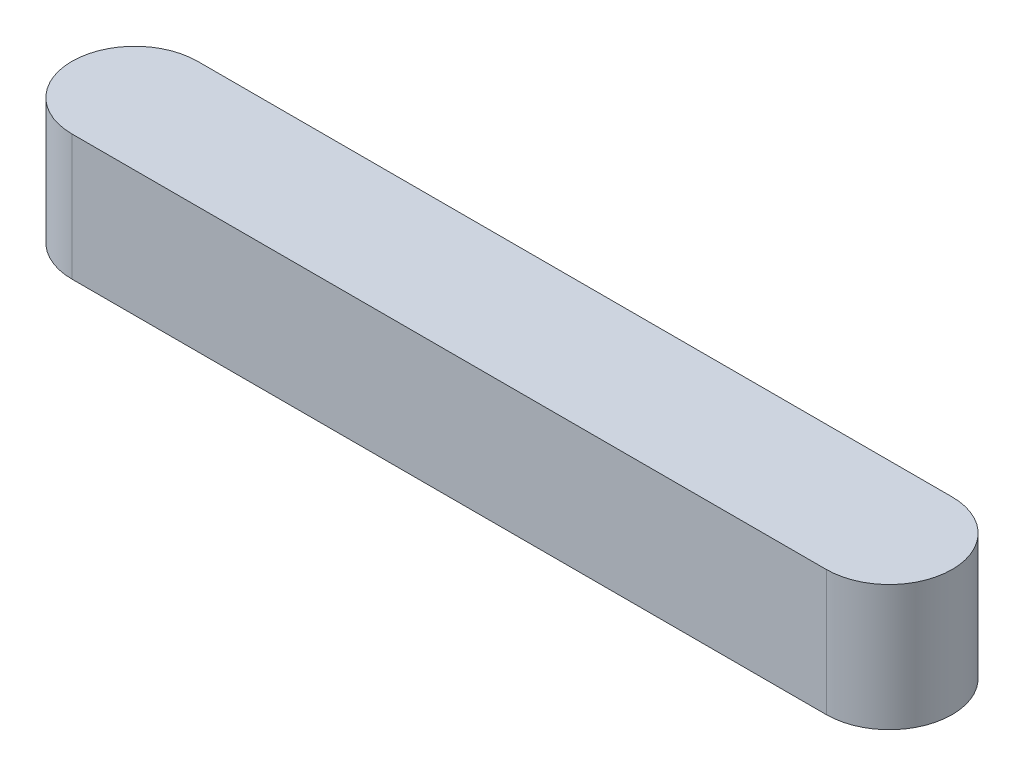
ISO-10303-21;
HEADER;
FILE_DESCRIPTION(('STEP AP214'),'2;1');
FILE_NAME('part.step','',(''),(''),'','','');
FILE_SCHEMA(('AUTOMOTIVE_DESIGN { 1 0 10303 214 1 1 1 1 }'));
ENDSEC;
DATA;
#1=APPLICATION_CONTEXT('core data for automotive mechanical design processes');
#2=APPLICATION_PROTOCOL_DEFINITION('international standard','automotive_design',2000,#1);
#3=PRODUCT_CONTEXT('',#1,'mechanical');
#4=PRODUCT('Part','Part','',(#3));
#5=PRODUCT_RELATED_PRODUCT_CATEGORY('part','',(#4));
#6=PRODUCT_DEFINITION_FORMATION('','',#4);
#7=PRODUCT_DEFINITION_CONTEXT('part definition',#1,'design');
#8=PRODUCT_DEFINITION('design','',#6,#7);
#9=PRODUCT_DEFINITION_SHAPE('','',#8);
#10=(LENGTH_UNIT() NAMED_UNIT(*) SI_UNIT(.MILLI.,.METRE.));
#11=(NAMED_UNIT(*) PLANE_ANGLE_UNIT() SI_UNIT($,.RADIAN.));
#12=(NAMED_UNIT(*) SI_UNIT($,.STERADIAN.) SOLID_ANGLE_UNIT());
#13=UNCERTAINTY_MEASURE_WITH_UNIT(LENGTH_MEASURE(1.E-05),#10,'distance_accuracy_value','');
#14=(GEOMETRIC_REPRESENTATION_CONTEXT(3) GLOBAL_UNCERTAINTY_ASSIGNED_CONTEXT((#13)) GLOBAL_UNIT_ASSIGNED_CONTEXT((#10,
#11,#12)) REPRESENTATION_CONTEXT('',''));
#15=CARTESIAN_POINT('',(0.,0.,0.));
#16=DIRECTION('',(0.,0.,1.));
#17=DIRECTION('',(1.,0.,0.));
#18=AXIS2_PLACEMENT_3D('',#15,#16,#17);
#19=CARTESIAN_POINT('',(-60.,20.,0.));
#20=DIRECTION('',(0.,-1.,0.));
#21=DIRECTION('',(0.,0.,-1.));
#22=AXIS2_PLACEMENT_3D('',#19,#20,#21);
#23=CYLINDRICAL_SURFACE('',#22,10.);
#24=CARTESIAN_POINT('',(-60.,0.,0.));
#25=DIRECTION('',(0.,1.,0.));
#26=DIRECTION('',(0.,0.,1.));
#27=AXIS2_PLACEMENT_3D('',#24,#25,#26);
#28=CIRCLE('',#27,10.);
#29=CARTESIAN_POINT('',(-60.,0.,-10.));
#30=VERTEX_POINT('',#29);
#31=CARTESIAN_POINT('',(-60.,0.,10.));
#32=VERTEX_POINT('',#31);
#33=EDGE_CURVE('E102',#30,#32,#28,.T.);
#34=ORIENTED_EDGE('',*,*,#33,.T.);
#35=DIRECTION('',(0.,-1.,0.));
#36=VECTOR('',#35,1.);
#37=CARTESIAN_POINT('',(-60.,20.,10.));
#38=LINE('',#37,#36);
#39=CARTESIAN_POINT('',(-60.,20.,10.));
#40=VERTEX_POINT('',#39);
#41=EDGE_CURVE('E11',#40,#32,#38,.T.);
#42=ORIENTED_EDGE('',*,*,#41,.F.);
#43=CARTESIAN_POINT('',(-60.,20.,0.));
#44=DIRECTION('',(0.,1.,0.));
#45=DIRECTION('',(0.,0.,1.));
#46=AXIS2_PLACEMENT_3D('',#43,#44,#45);
#47=CIRCLE('',#46,10.);
#48=CARTESIAN_POINT('',(-60.,20.,-10.));
#49=VERTEX_POINT('',#48);
#50=EDGE_CURVE('E88',#49,#40,#47,.T.);
#51=ORIENTED_EDGE('',*,*,#50,.F.);
#52=DIRECTION('',(0.,-1.,0.));
#53=VECTOR('',#52,1.);
#54=CARTESIAN_POINT('',(-60.,20.,-10.));
#55=LINE('',#54,#53);
#56=EDGE_CURVE('E55',#49,#30,#55,.T.);
#57=ORIENTED_EDGE('',*,*,#56,.T.);
#58=EDGE_LOOP('',(#34,#42,#51,#57));
#59=FACE_BOUND('',#58,.T.);
#60=ADVANCED_FACE('F39',(#59),#23,.T.);
#61=CARTESIAN_POINT('',(-60.,20.,10.));
#62=DIRECTION('',(0.,0.,-1.));
#63=DIRECTION('',(-1.,0.,0.));
#64=AXIS2_PLACEMENT_3D('',#61,#62,#63);
#65=PLANE('',#64);
#66=DIRECTION('',(1.,0.,0.));
#67=VECTOR('',#66,1.);
#68=CARTESIAN_POINT('',(-60.,0.,10.));
#69=LINE('',#68,#67);
#70=CARTESIAN_POINT('',(60.,0.,9.99999999999998));
#71=VERTEX_POINT('',#70);
#72=EDGE_CURVE('E93',#32,#71,#69,.T.);
#73=ORIENTED_EDGE('',*,*,#72,.T.);
#74=DIRECTION('',(0.,-1.,0.));
#75=VECTOR('',#74,1.);
#76=CARTESIAN_POINT('',(60.,20.,9.99999999999998));
#77=LINE('',#76,#75);
#78=CARTESIAN_POINT('',(60.,20.,9.99999999999998));
#79=VERTEX_POINT('',#78);
#80=EDGE_CURVE('E47',#79,#71,#77,.T.);
#81=ORIENTED_EDGE('',*,*,#80,.F.);
#82=DIRECTION('',(1.,0.,0.));
#83=VECTOR('',#82,1.);
#84=CARTESIAN_POINT('',(-60.,20.,10.));
#85=LINE('',#84,#83);
#86=EDGE_CURVE('E81',#40,#79,#85,.T.);
#87=ORIENTED_EDGE('',*,*,#86,.F.);
#88=ORIENTED_EDGE('',*,*,#41,.T.);
#89=EDGE_LOOP('',(#73,#81,#87,#88));
#90=FACE_BOUND('',#89,.T.);
#91=ADVANCED_FACE('F92',(#90),#65,.F.);
#92=CARTESIAN_POINT('',(60.,20.,0.));
#93=DIRECTION('',(0.,-1.,0.));
#94=DIRECTION('',(0.,0.,-1.));
#95=AXIS2_PLACEMENT_3D('',#92,#93,#94);
#96=CYLINDRICAL_SURFACE('',#95,10.);
#97=CARTESIAN_POINT('',(60.,0.,0.));
#98=DIRECTION('',(0.,1.,0.));
#99=DIRECTION('',(0.,0.,1.));
#100=AXIS2_PLACEMENT_3D('',#97,#98,#99);
#101=CIRCLE('',#100,10.);
#102=CARTESIAN_POINT('',(60.,0.,-10.));
#103=VERTEX_POINT('',#102);
#104=EDGE_CURVE('E105',#71,#103,#101,.T.);
#105=ORIENTED_EDGE('',*,*,#104,.T.);
#106=DIRECTION('',(0.,-1.,0.));
#107=VECTOR('',#106,1.);
#108=CARTESIAN_POINT('',(60.,20.,-10.));
#109=LINE('',#108,#107);
#110=CARTESIAN_POINT('',(60.,20.,-10.));
#111=VERTEX_POINT('',#110);
#112=EDGE_CURVE('E70',#111,#103,#109,.T.);
#113=ORIENTED_EDGE('',*,*,#112,.F.);
#114=CARTESIAN_POINT('',(60.,20.,0.));
#115=DIRECTION('',(0.,1.,0.));
#116=DIRECTION('',(0.,0.,1.));
#117=AXIS2_PLACEMENT_3D('',#114,#115,#116);
#118=CIRCLE('',#117,10.);
#119=EDGE_CURVE('E87',#79,#111,#118,.T.);
#120=ORIENTED_EDGE('',*,*,#119,.F.);
#121=ORIENTED_EDGE('',*,*,#80,.T.);
#122=EDGE_LOOP('',(#105,#113,#120,#121));
#123=FACE_BOUND('',#122,.T.);
#124=ADVANCED_FACE('F96',(#123),#96,.T.);
#125=CARTESIAN_POINT('',(-60.,20.,-10.));
#126=DIRECTION('',(0.,0.,-1.));
#127=DIRECTION('',(-1.,0.,0.));
#128=AXIS2_PLACEMENT_3D('',#125,#126,#127);
#129=PLANE('',#128);
#130=DIRECTION('',(1.,0.,0.));
#131=VECTOR('',#130,1.);
#132=CARTESIAN_POINT('',(-60.,0.,-10.));
#133=LINE('',#132,#131);
#134=EDGE_CURVE('E107',#30,#103,#133,.T.);
#135=ORIENTED_EDGE('',*,*,#134,.F.);
#136=ORIENTED_EDGE('',*,*,#56,.F.);
#137=DIRECTION('',(1.,0.,0.));
#138=VECTOR('',#137,1.);
#139=CARTESIAN_POINT('',(-60.,20.,-10.));
#140=LINE('',#139,#138);
#141=EDGE_CURVE('E97',#49,#111,#140,.T.);
#142=ORIENTED_EDGE('',*,*,#141,.T.);
#143=ORIENTED_EDGE('',*,*,#112,.T.);
#144=EDGE_LOOP('',(#135,#136,#142,#143));
#145=FACE_BOUND('',#144,.T.);
#146=ADVANCED_FACE('F113',(#145),#129,.T.);
#147=CARTESIAN_POINT('',(-60.,20.,0.));
#148=DIRECTION('',(0.,1.,0.));
#149=DIRECTION('',(0.,0.,1.));
#150=AXIS2_PLACEMENT_3D('',#147,#148,#149);
#151=PLANE('',#150);
#152=ORIENTED_EDGE('',*,*,#50,.T.);
#153=ORIENTED_EDGE('',*,*,#86,.T.);
#154=ORIENTED_EDGE('',*,*,#119,.T.);
#155=ORIENTED_EDGE('',*,*,#141,.F.);
#156=EDGE_LOOP('',(#152,#153,#154,#155));
#157=FACE_BOUND('',#156,.T.);
#158=ADVANCED_FACE('F84',(#157),#151,.T.);
#159=CARTESIAN_POINT('',(-60.,0.,0.));
#160=DIRECTION('',(0.,1.,0.));
#161=DIRECTION('',(0.,0.,1.));
#162=AXIS2_PLACEMENT_3D('',#159,#160,#161);
#163=PLANE('',#162);
#164=ORIENTED_EDGE('',*,*,#33,.F.);
#165=ORIENTED_EDGE('',*,*,#134,.T.);
#166=ORIENTED_EDGE('',*,*,#104,.F.);
#167=ORIENTED_EDGE('',*,*,#72,.F.);
#168=EDGE_LOOP('',(#164,#165,#166,#167));
#169=FACE_BOUND('',#168,.T.);
#170=ADVANCED_FACE('F112',(#169),#163,.F.);
#171=CLOSED_SHELL('',(#60,#91,#124,#146,#158,#170));
#172=MANIFOLD_SOLID_BREP('B2',#171);
#173=ADVANCED_BREP_SHAPE_REPRESENTATION('',(#18,#172),#14);
#174=SHAPE_DEFINITION_REPRESENTATION(#9,#173);
ENDSEC;
END-ISO-10303-21;
